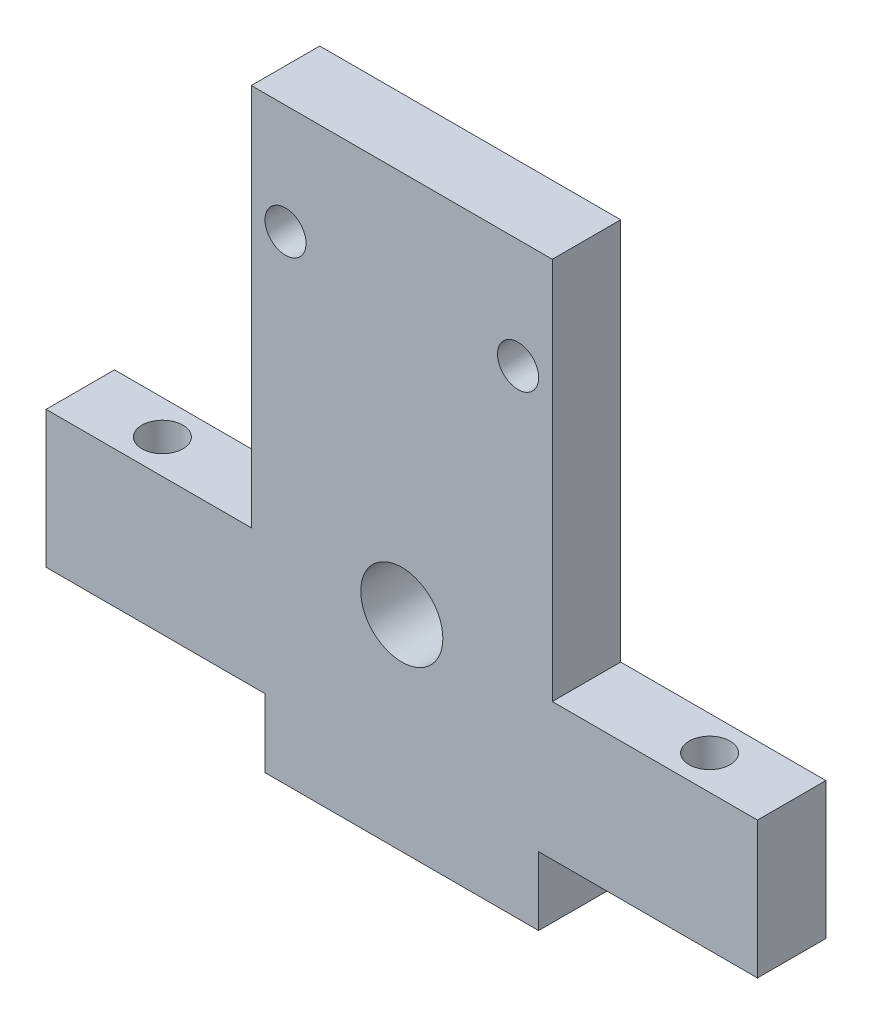
ISO-10303-21;
HEADER;
FILE_DESCRIPTION(('STEP AP214'),'2;1');
FILE_NAME('part.step','',(''),(''),'','','');
FILE_SCHEMA(('AUTOMOTIVE_DESIGN { 1 0 10303 214 1 1 1 1 }'));
ENDSEC;
DATA;
#1=APPLICATION_CONTEXT('core data for automotive mechanical design processes');
#2=APPLICATION_PROTOCOL_DEFINITION('international standard','automotive_design',2000,#1);
#3=PRODUCT_CONTEXT('',#1,'mechanical');
#4=PRODUCT('Part','Part','',(#3));
#5=PRODUCT_RELATED_PRODUCT_CATEGORY('part','',(#4));
#6=PRODUCT_DEFINITION_FORMATION('','',#4);
#7=PRODUCT_DEFINITION_CONTEXT('part definition',#1,'design');
#8=PRODUCT_DEFINITION('design','',#6,#7);
#9=PRODUCT_DEFINITION_SHAPE('','',#8);
#10=(LENGTH_UNIT() NAMED_UNIT(*) SI_UNIT(.MILLI.,.METRE.));
#11=(NAMED_UNIT(*) PLANE_ANGLE_UNIT() SI_UNIT($,.RADIAN.));
#12=(NAMED_UNIT(*) SI_UNIT($,.STERADIAN.) SOLID_ANGLE_UNIT());
#13=UNCERTAINTY_MEASURE_WITH_UNIT(LENGTH_MEASURE(1.E-05),#10,'distance_accuracy_value','');
#14=(GEOMETRIC_REPRESENTATION_CONTEXT(3) GLOBAL_UNCERTAINTY_ASSIGNED_CONTEXT((#13)) GLOBAL_UNIT_ASSIGNED_CONTEXT((#10,
#11,#12)) REPRESENTATION_CONTEXT('',''));
#15=CARTESIAN_POINT('',(0.,0.,0.));
#16=DIRECTION('',(0.,0.,1.));
#17=DIRECTION('',(1.,0.,0.));
#18=AXIS2_PLACEMENT_3D('',#15,#16,#17);
#19=CARTESIAN_POINT('',(0.,0.,5.));
#20=DIRECTION('',(0.,0.,-1.));
#21=DIRECTION('',(-1.,0.,0.));
#22=AXIS2_PLACEMENT_3D('',#19,#20,#21);
#23=PLANE('',#22);
#24=DIRECTION('',(1.,0.,0.));
#25=VECTOR('',#24,1.);
#26=CARTESIAN_POINT('',(11.0839139856643,-16.1701510753259,5.));
#27=LINE('',#26,#25);
#28=CARTESIAN_POINT('',(11.0839139856643,-16.1701510753259,5.));
#29=VERTEX_POINT('',#28);
#30=CARTESIAN_POINT('',(27.0839139856643,-16.1701510753259,5.));
#31=VERTEX_POINT('',#30);
#32=EDGE_CURVE('E179',#29,#31,#27,.T.);
#33=ORIENTED_EDGE('',*,*,#32,.T.);
#34=DIRECTION('',(0.,1.,0.));
#35=VECTOR('',#34,1.);
#36=CARTESIAN_POINT('',(27.0839139856643,-6.17015107532594,5.));
#37=LINE('',#36,#35);
#38=CARTESIAN_POINT('',(27.0839139856643,-6.17015107532594,5.));
#39=VERTEX_POINT('',#38);
#40=EDGE_CURVE('E107',#31,#39,#37,.T.);
#41=ORIENTED_EDGE('',*,*,#40,.T.);
#42=DIRECTION('',(-1.,0.,0.));
#43=VECTOR('',#42,1.);
#44=CARTESIAN_POINT('',(12.0839139856643,-6.17015107532594,5.));
#45=LINE('',#44,#43);
#46=CARTESIAN_POINT('',(12.0839139856643,-6.17015107532594,5.));
#47=VERTEX_POINT('',#46);
#48=EDGE_CURVE('E206',#39,#47,#45,.T.);
#49=ORIENTED_EDGE('',*,*,#48,.T.);
#50=DIRECTION('',(0.,1.,0.));
#51=VECTOR('',#50,1.);
#52=CARTESIAN_POINT('',(12.0839139856643,-6.17015107532594,5.));
#53=LINE('',#52,#51);
#54=CARTESIAN_POINT('',(12.0839139856642,21.8298489246741,5.));
#55=VERTEX_POINT('',#54);
#56=EDGE_CURVE('E225',#47,#55,#53,.T.);
#57=ORIENTED_EDGE('',*,*,#56,.T.);
#58=DIRECTION('',(-1.,0.,0.));
#59=VECTOR('',#58,1.);
#60=CARTESIAN_POINT('',(-9.91608601433575,21.8298489246741,5.));
#61=LINE('',#60,#59);
#62=CARTESIAN_POINT('',(-9.91608601433575,21.8298489246741,5.));
#63=VERTEX_POINT('',#62);
#64=EDGE_CURVE('E222',#55,#63,#61,.T.);
#65=ORIENTED_EDGE('',*,*,#64,.T.);
#66=DIRECTION('',(0.,-1.,0.));
#67=VECTOR('',#66,1.);
#68=CARTESIAN_POINT('',(-9.91608601433574,-6.17015107532594,5.));
#69=LINE('',#68,#67);
#70=CARTESIAN_POINT('',(-9.91608601433574,-6.17015107532594,5.));
#71=VERTEX_POINT('',#70);
#72=EDGE_CURVE('E224',#63,#71,#69,.T.);
#73=ORIENTED_EDGE('',*,*,#72,.T.);
#74=DIRECTION('',(-1.,0.,0.));
#75=VECTOR('',#74,1.);
#76=CARTESIAN_POINT('',(-9.91608601433574,-6.17015107532594,5.));
#77=LINE('',#76,#75);
#78=CARTESIAN_POINT('',(-24.9160860143357,-6.17015107532594,5.));
#79=VERTEX_POINT('',#78);
#80=EDGE_CURVE('E227',#71,#79,#77,.T.);
#81=ORIENTED_EDGE('',*,*,#80,.T.);
#82=DIRECTION('',(0.,-1.,0.));
#83=VECTOR('',#82,1.);
#84=CARTESIAN_POINT('',(-24.9160860143357,-6.17015107532594,5.));
#85=LINE('',#84,#83);
#86=CARTESIAN_POINT('',(-24.9160860143357,-16.1701510753259,5.));
#87=VERTEX_POINT('',#86);
#88=EDGE_CURVE('E233',#79,#87,#85,.T.);
#89=ORIENTED_EDGE('',*,*,#88,.T.);
#90=DIRECTION('',(1.,0.,0.));
#91=VECTOR('',#90,1.);
#92=CARTESIAN_POINT('',(-24.9160860143357,-16.1701510753259,5.));
#93=LINE('',#92,#91);
#94=CARTESIAN_POINT('',(-8.91608601433574,-16.1701510753259,5.));
#95=VERTEX_POINT('',#94);
#96=EDGE_CURVE('E138',#87,#95,#93,.T.);
#97=ORIENTED_EDGE('',*,*,#96,.T.);
#98=DIRECTION('',(0.,-1.,0.));
#99=VECTOR('',#98,1.);
#100=CARTESIAN_POINT('',(-8.91608601433574,-16.1701510753259,5.));
#101=LINE('',#100,#99);
#102=CARTESIAN_POINT('',(-8.91608601433574,-21.1701510753259,5.));
#103=VERTEX_POINT('',#102);
#104=EDGE_CURVE('E132',#95,#103,#101,.T.);
#105=ORIENTED_EDGE('',*,*,#104,.T.);
#106=DIRECTION('',(1.,0.,0.));
#107=VECTOR('',#106,1.);
#108=CARTESIAN_POINT('',(-8.91608601433574,-21.1701510753259,5.));
#109=LINE('',#108,#107);
#110=CARTESIAN_POINT('',(11.0839139856643,-21.1701510753259,5.));
#111=VERTEX_POINT('',#110);
#112=EDGE_CURVE('E136',#103,#111,#109,.T.);
#113=ORIENTED_EDGE('',*,*,#112,.T.);
#114=DIRECTION('',(0.,1.,0.));
#115=VECTOR('',#114,1.);
#116=CARTESIAN_POINT('',(11.0839139856643,-21.1701510753259,5.));
#117=LINE('',#116,#115);
#118=EDGE_CURVE('E52',#111,#29,#117,.T.);
#119=ORIENTED_EDGE('',*,*,#118,.T.);
#120=EDGE_LOOP('',(#33,#41,#49,#57,#65,#73,#81,#89,#97,#105,#113,#119));
#121=FACE_BOUND('',#120,.T.);
#122=CARTESIAN_POINT('',(1.08391398566426,-6.17015107532594,5.));
#123=DIRECTION('',(0.,0.,1.));
#124=DIRECTION('',(1.,0.,0.));
#125=AXIS2_PLACEMENT_3D('',#122,#123,#124);
#126=CIRCLE('',#125,3.);
#127=CARTESIAN_POINT('',(4.08391398566426,-6.17015107532594,5.));
#128=VERTEX_POINT('',#127);
#129=EDGE_CURVE('E160',#128,#128,#126,.T.);
#130=ORIENTED_EDGE('',*,*,#129,.F.);
#131=EDGE_LOOP('',(#130));
#132=FACE_BOUND('',#131,.T.);
#133=CARTESIAN_POINT('',(-7.41608601433575,13.8298489246741,5.));
#134=DIRECTION('',(0.,0.,1.));
#135=DIRECTION('',(1.,0.,0.));
#136=AXIS2_PLACEMENT_3D('',#133,#134,#135);
#137=CIRCLE('',#136,1.5);
#138=CARTESIAN_POINT('',(-5.91608601433575,13.8298489246741,5.));
#139=VERTEX_POINT('',#138);
#140=EDGE_CURVE('E307',#139,#139,#137,.T.);
#141=ORIENTED_EDGE('',*,*,#140,.F.);
#142=EDGE_LOOP('',(#141));
#143=FACE_BOUND('',#142,.T.);
#144=CARTESIAN_POINT('',(9.58391398566425,13.8298489246741,5.));
#145=DIRECTION('',(0.,0.,1.));
#146=DIRECTION('',(-1.,0.,0.));
#147=AXIS2_PLACEMENT_3D('',#144,#145,#146);
#148=CIRCLE('',#147,1.5);
#149=CARTESIAN_POINT('',(8.08391398566425,13.8298489246741,5.));
#150=VERTEX_POINT('',#149);
#151=EDGE_CURVE('E301',#150,#150,#148,.T.);
#152=ORIENTED_EDGE('',*,*,#151,.F.);
#153=EDGE_LOOP('',(#152));
#154=FACE_BOUND('',#153,.T.);
#155=ADVANCED_FACE('F35',(#121,#132,#143,#154),#23,.F.);
#156=CARTESIAN_POINT('',(0.,0.,0.));
#157=DIRECTION('',(0.,0.,-1.));
#158=DIRECTION('',(-1.,0.,0.));
#159=AXIS2_PLACEMENT_3D('',#156,#157,#158);
#160=PLANE('',#159);
#161=CARTESIAN_POINT('',(-7.41608601433575,13.8298489246741,0.));
#162=DIRECTION('',(0.,0.,1.));
#163=DIRECTION('',(1.,0.,0.));
#164=AXIS2_PLACEMENT_3D('',#161,#162,#163);
#165=CIRCLE('',#164,1.5);
#166=CARTESIAN_POINT('',(-5.91608601433575,13.8298489246741,0.));
#167=VERTEX_POINT('',#166);
#168=EDGE_CURVE('E304',#167,#167,#165,.T.);
#169=ORIENTED_EDGE('',*,*,#168,.T.);
#170=EDGE_LOOP('',(#169));
#171=FACE_BOUND('',#170,.T.);
#172=DIRECTION('',(1.,0.,0.));
#173=VECTOR('',#172,1.);
#174=CARTESIAN_POINT('',(11.0839139856643,-16.1701510753259,0.));
#175=LINE('',#174,#173);
#176=CARTESIAN_POINT('',(11.0839139856643,-16.1701510753259,0.));
#177=VERTEX_POINT('',#176);
#178=CARTESIAN_POINT('',(27.0839139856643,-16.1701510753259,0.));
#179=VERTEX_POINT('',#178);
#180=EDGE_CURVE('E156',#177,#179,#175,.T.);
#181=ORIENTED_EDGE('',*,*,#180,.F.);
#182=DIRECTION('',(0.,1.,0.));
#183=VECTOR('',#182,1.);
#184=CARTESIAN_POINT('',(11.0839139856643,-21.1701510753259,0.));
#185=LINE('',#184,#183);
#186=CARTESIAN_POINT('',(11.0839139856643,-21.1701510753259,0.));
#187=VERTEX_POINT('',#186);
#188=EDGE_CURVE('E99',#187,#177,#185,.T.);
#189=ORIENTED_EDGE('',*,*,#188,.F.);
#190=DIRECTION('',(1.,0.,0.));
#191=VECTOR('',#190,1.);
#192=CARTESIAN_POINT('',(-8.91608601433574,-21.1701510753259,0.));
#193=LINE('',#192,#191);
#194=CARTESIAN_POINT('',(-8.91608601433574,-21.1701510753259,0.));
#195=VERTEX_POINT('',#194);
#196=EDGE_CURVE('E93',#195,#187,#193,.T.);
#197=ORIENTED_EDGE('',*,*,#196,.F.);
#198=DIRECTION('',(0.,-1.,0.));
#199=VECTOR('',#198,1.);
#200=CARTESIAN_POINT('',(-8.91608601433574,-16.1701510753259,0.));
#201=LINE('',#200,#199);
#202=CARTESIAN_POINT('',(-8.91608601433574,-16.1701510753259,0.));
#203=VERTEX_POINT('',#202);
#204=EDGE_CURVE('E146',#203,#195,#201,.T.);
#205=ORIENTED_EDGE('',*,*,#204,.F.);
#206=DIRECTION('',(1.,0.,0.));
#207=VECTOR('',#206,1.);
#208=CARTESIAN_POINT('',(-24.9160860143357,-16.1701510753259,0.));
#209=LINE('',#208,#207);
#210=CARTESIAN_POINT('',(-24.9160860143357,-16.1701510753259,0.));
#211=VERTEX_POINT('',#210);
#212=EDGE_CURVE('E174',#211,#203,#209,.T.);
#213=ORIENTED_EDGE('',*,*,#212,.F.);
#214=DIRECTION('',(0.,-1.,0.));
#215=VECTOR('',#214,1.);
#216=CARTESIAN_POINT('',(-24.9160860143357,-6.17015107532594,0.));
#217=LINE('',#216,#215);
#218=CARTESIAN_POINT('',(-24.9160860143357,-6.17015107532594,0.));
#219=VERTEX_POINT('',#218);
#220=EDGE_CURVE('E172',#219,#211,#217,.T.);
#221=ORIENTED_EDGE('',*,*,#220,.F.);
#222=DIRECTION('',(-1.,0.,0.));
#223=VECTOR('',#222,1.);
#224=CARTESIAN_POINT('',(-9.91608601433574,-6.17015107532594,0.));
#225=LINE('',#224,#223);
#226=CARTESIAN_POINT('',(-9.91608601433574,-6.17015107532594,0.));
#227=VERTEX_POINT('',#226);
#228=EDGE_CURVE('E170',#227,#219,#225,.T.);
#229=ORIENTED_EDGE('',*,*,#228,.F.);
#230=DIRECTION('',(0.,-1.,0.));
#231=VECTOR('',#230,1.);
#232=CARTESIAN_POINT('',(-9.91608601433574,-6.17015107532594,0.));
#233=LINE('',#232,#231);
#234=CARTESIAN_POINT('',(-9.91608601433575,21.8298489246741,0.));
#235=VERTEX_POINT('',#234);
#236=EDGE_CURVE('E168',#235,#227,#233,.T.);
#237=ORIENTED_EDGE('',*,*,#236,.F.);
#238=DIRECTION('',(-1.,0.,0.));
#239=VECTOR('',#238,1.);
#240=CARTESIAN_POINT('',(-9.91608601433575,21.8298489246741,0.));
#241=LINE('',#240,#239);
#242=CARTESIAN_POINT('',(12.0839139856642,21.8298489246741,0.));
#243=VERTEX_POINT('',#242);
#244=EDGE_CURVE('E166',#243,#235,#241,.T.);
#245=ORIENTED_EDGE('',*,*,#244,.F.);
#246=DIRECTION('',(0.,1.,0.));
#247=VECTOR('',#246,1.);
#248=CARTESIAN_POINT('',(12.0839139856643,-6.17015107532594,0.));
#249=LINE('',#248,#247);
#250=CARTESIAN_POINT('',(12.0839139856643,-6.17015107532594,0.));
#251=VERTEX_POINT('',#250);
#252=EDGE_CURVE('E164',#251,#243,#249,.T.);
#253=ORIENTED_EDGE('',*,*,#252,.F.);
#254=DIRECTION('',(-1.,0.,0.));
#255=VECTOR('',#254,1.);
#256=CARTESIAN_POINT('',(12.0839139856643,-6.17015107532594,0.));
#257=LINE('',#256,#255);
#258=CARTESIAN_POINT('',(27.0839139856643,-6.17015107532594,0.));
#259=VERTEX_POINT('',#258);
#260=EDGE_CURVE('E162',#259,#251,#257,.T.);
#261=ORIENTED_EDGE('',*,*,#260,.F.);
#262=DIRECTION('',(0.,1.,0.));
#263=VECTOR('',#262,1.);
#264=CARTESIAN_POINT('',(27.0839139856643,-6.17015107532594,0.));
#265=LINE('',#264,#263);
#266=EDGE_CURVE('E159',#179,#259,#265,.T.);
#267=ORIENTED_EDGE('',*,*,#266,.F.);
#268=EDGE_LOOP('',(#181,#189,#197,#205,#213,#221,#229,#237,#245,#253,#261,#267));
#269=FACE_BOUND('',#268,.T.);
#270=CARTESIAN_POINT('',(1.08391398566426,-6.17015107532594,0.));
#271=DIRECTION('',(0.,0.,1.));
#272=DIRECTION('',(1.,0.,0.));
#273=AXIS2_PLACEMENT_3D('',#270,#271,#272);
#274=CIRCLE('',#273,3.);
#275=CARTESIAN_POINT('',(4.08391398566426,-6.17015107532594,0.));
#276=VERTEX_POINT('',#275);
#277=EDGE_CURVE('E310',#276,#276,#274,.T.);
#278=ORIENTED_EDGE('',*,*,#277,.T.);
#279=EDGE_LOOP('',(#278));
#280=FACE_BOUND('',#279,.T.);
#281=CARTESIAN_POINT('',(9.58391398566425,13.8298489246741,0.));
#282=DIRECTION('',(0.,0.,1.));
#283=DIRECTION('',(-1.,0.,0.));
#284=AXIS2_PLACEMENT_3D('',#281,#282,#283);
#285=CIRCLE('',#284,1.5);
#286=CARTESIAN_POINT('',(8.08391398566425,13.8298489246741,0.));
#287=VERTEX_POINT('',#286);
#288=EDGE_CURVE('E298',#287,#287,#285,.T.);
#289=ORIENTED_EDGE('',*,*,#288,.T.);
#290=EDGE_LOOP('',(#289));
#291=FACE_BOUND('',#290,.T.);
#292=ADVANCED_FACE('F210',(#171,#269,#280,#291),#160,.T.);
#293=CARTESIAN_POINT('',(11.0839139856643,-16.1701510753259,5.));
#294=DIRECTION('',(0.,1.,0.));
#295=DIRECTION('',(0.,0.,1.));
#296=AXIS2_PLACEMENT_3D('',#293,#294,#295);
#297=PLANE('',#296);
#298=CARTESIAN_POINT('',(21.0839139856642,-16.1701510753259,2.5));
#299=DIRECTION('',(0.,1.,0.));
#300=DIRECTION('',(1.,0.,0.));
#301=AXIS2_PLACEMENT_3D('',#298,#299,#300);
#302=CIRCLE('',#301,1.49999999999999);
#303=CARTESIAN_POINT('',(22.5839139856642,-16.1701510753259,2.5));
#304=VERTEX_POINT('',#303);
#305=EDGE_CURVE('E286',#304,#304,#302,.T.);
#306=ORIENTED_EDGE('',*,*,#305,.T.);
#307=EDGE_LOOP('',(#306));
#308=FACE_BOUND('',#307,.T.);
#309=ORIENTED_EDGE('',*,*,#180,.T.);
#310=DIRECTION('',(0.,0.,-1.));
#311=VECTOR('',#310,1.);
#312=CARTESIAN_POINT('',(27.0839139856643,-16.1701510753259,5.));
#313=LINE('',#312,#311);
#314=EDGE_CURVE('E11',#31,#179,#313,.T.);
#315=ORIENTED_EDGE('',*,*,#314,.F.);
#316=ORIENTED_EDGE('',*,*,#32,.F.);
#317=DIRECTION('',(0.,0.,-1.));
#318=VECTOR('',#317,1.);
#319=CARTESIAN_POINT('',(11.0839139856643,-16.1701510753259,5.));
#320=LINE('',#319,#318);
#321=EDGE_CURVE('E152',#29,#177,#320,.T.);
#322=ORIENTED_EDGE('',*,*,#321,.T.);
#323=EDGE_LOOP('',(#309,#315,#316,#322));
#324=FACE_BOUND('',#323,.T.);
#325=ADVANCED_FACE('F37',(#308,#324),#297,.F.);
#326=CARTESIAN_POINT('',(27.0839139856643,-6.17015107532594,5.));
#327=DIRECTION('',(-1.,0.,0.));
#328=DIRECTION('',(0.,0.,1.));
#329=AXIS2_PLACEMENT_3D('',#326,#327,#328);
#330=PLANE('',#329);
#331=ORIENTED_EDGE('',*,*,#266,.T.);
#332=DIRECTION('',(0.,0.,-1.));
#333=VECTOR('',#332,1.);
#334=CARTESIAN_POINT('',(27.0839139856643,-6.17015107532594,5.));
#335=LINE('',#334,#333);
#336=EDGE_CURVE('E44',#39,#259,#335,.T.);
#337=ORIENTED_EDGE('',*,*,#336,.F.);
#338=ORIENTED_EDGE('',*,*,#40,.F.);
#339=ORIENTED_EDGE('',*,*,#314,.T.);
#340=EDGE_LOOP('',(#331,#337,#338,#339));
#341=FACE_BOUND('',#340,.T.);
#342=ADVANCED_FACE('F352',(#341),#330,.F.);
#343=CARTESIAN_POINT('',(12.0839139856643,-6.17015107532594,5.));
#344=DIRECTION('',(0.,-1.,0.));
#345=DIRECTION('',(1.,0.,0.));
#346=AXIS2_PLACEMENT_3D('',#343,#344,#345);
#347=PLANE('',#346);
#348=CARTESIAN_POINT('',(21.0839139856642,-6.17015107532594,2.5));
#349=DIRECTION('',(0.,1.,0.));
#350=DIRECTION('',(1.,0.,0.));
#351=AXIS2_PLACEMENT_3D('',#348,#349,#350);
#352=CIRCLE('',#351,1.49999999999999);
#353=CARTESIAN_POINT('',(22.5839139856642,-6.17015107532594,2.5));
#354=VERTEX_POINT('',#353);
#355=EDGE_CURVE('E289',#354,#354,#352,.T.);
#356=ORIENTED_EDGE('',*,*,#355,.F.);
#357=EDGE_LOOP('',(#356));
#358=FACE_BOUND('',#357,.T.);
#359=ORIENTED_EDGE('',*,*,#260,.T.);
#360=DIRECTION('',(0.,0.,-1.));
#361=VECTOR('',#360,1.);
#362=CARTESIAN_POINT('',(12.0839139856643,-6.17015107532594,5.));
#363=LINE('',#362,#361);
#364=EDGE_CURVE('E198',#47,#251,#363,.T.);
#365=ORIENTED_EDGE('',*,*,#364,.F.);
#366=ORIENTED_EDGE('',*,*,#48,.F.);
#367=ORIENTED_EDGE('',*,*,#336,.T.);
#368=EDGE_LOOP('',(#359,#365,#366,#367));
#369=FACE_BOUND('',#368,.T.);
#370=ADVANCED_FACE('F204',(#358,#369),#347,.F.);
#371=CARTESIAN_POINT('',(12.0839139856643,-6.17015107532594,5.));
#372=DIRECTION('',(-1.,0.,0.));
#373=DIRECTION('',(0.,-1.,0.));
#374=AXIS2_PLACEMENT_3D('',#371,#372,#373);
#375=PLANE('',#374);
#376=ORIENTED_EDGE('',*,*,#252,.T.);
#377=DIRECTION('',(0.,0.,-1.));
#378=VECTOR('',#377,1.);
#379=CARTESIAN_POINT('',(12.0839139856642,21.8298489246741,5.));
#380=LINE('',#379,#378);
#381=EDGE_CURVE('E195',#55,#243,#380,.T.);
#382=ORIENTED_EDGE('',*,*,#381,.F.);
#383=ORIENTED_EDGE('',*,*,#56,.F.);
#384=ORIENTED_EDGE('',*,*,#364,.T.);
#385=EDGE_LOOP('',(#376,#382,#383,#384));
#386=FACE_BOUND('',#385,.T.);
#387=ADVANCED_FACE('F216',(#386),#375,.F.);
#388=CARTESIAN_POINT('',(-9.91608601433575,21.8298489246741,5.));
#389=DIRECTION('',(0.,-1.,0.));
#390=DIRECTION('',(1.,0.,0.));
#391=AXIS2_PLACEMENT_3D('',#388,#389,#390);
#392=PLANE('',#391);
#393=ORIENTED_EDGE('',*,*,#244,.T.);
#394=DIRECTION('',(0.,0.,-1.));
#395=VECTOR('',#394,1.);
#396=CARTESIAN_POINT('',(-9.91608601433575,21.8298489246741,5.));
#397=LINE('',#396,#395);
#398=EDGE_CURVE('E192',#63,#235,#397,.T.);
#399=ORIENTED_EDGE('',*,*,#398,.F.);
#400=ORIENTED_EDGE('',*,*,#64,.F.);
#401=ORIENTED_EDGE('',*,*,#381,.T.);
#402=EDGE_LOOP('',(#393,#399,#400,#401));
#403=FACE_BOUND('',#402,.T.);
#404=ADVANCED_FACE('F220',(#403),#392,.F.);
#405=CARTESIAN_POINT('',(-9.91608601433574,-6.17015107532594,5.));
#406=DIRECTION('',(1.,0.,0.));
#407=DIRECTION('',(0.,1.,0.));
#408=AXIS2_PLACEMENT_3D('',#405,#406,#407);
#409=PLANE('',#408);
#410=ORIENTED_EDGE('',*,*,#236,.T.);
#411=DIRECTION('',(0.,0.,-1.));
#412=VECTOR('',#411,1.);
#413=CARTESIAN_POINT('',(-9.91608601433574,-6.17015107532594,5.));
#414=LINE('',#413,#412);
#415=EDGE_CURVE('E189',#71,#227,#414,.T.);
#416=ORIENTED_EDGE('',*,*,#415,.F.);
#417=ORIENTED_EDGE('',*,*,#72,.F.);
#418=ORIENTED_EDGE('',*,*,#398,.T.);
#419=EDGE_LOOP('',(#410,#416,#417,#418));
#420=FACE_BOUND('',#419,.T.);
#421=ADVANCED_FACE('F336',(#420),#409,.F.);
#422=CARTESIAN_POINT('',(-9.91608601433574,-6.17015107532594,5.));
#423=DIRECTION('',(0.,-1.,0.));
#424=DIRECTION('',(1.,0.,0.));
#425=AXIS2_PLACEMENT_3D('',#422,#423,#424);
#426=PLANE('',#425);
#427=CARTESIAN_POINT('',(-18.9160860143357,-6.17015107532594,2.5));
#428=DIRECTION('',(0.,1.,0.));
#429=DIRECTION('',(-1.,0.,0.));
#430=AXIS2_PLACEMENT_3D('',#427,#428,#429);
#431=CIRCLE('',#430,1.5);
#432=CARTESIAN_POINT('',(-20.4160860143357,-6.17015107532594,2.5));
#433=VERTEX_POINT('',#432);
#434=EDGE_CURVE('E292',#433,#433,#431,.T.);
#435=ORIENTED_EDGE('',*,*,#434,.F.);
#436=EDGE_LOOP('',(#435));
#437=FACE_BOUND('',#436,.T.);
#438=ORIENTED_EDGE('',*,*,#228,.T.);
#439=DIRECTION('',(0.,0.,-1.));
#440=VECTOR('',#439,1.);
#441=CARTESIAN_POINT('',(-24.9160860143357,-6.17015107532594,5.));
#442=LINE('',#441,#440);
#443=EDGE_CURVE('E186',#79,#219,#442,.T.);
#444=ORIENTED_EDGE('',*,*,#443,.F.);
#445=ORIENTED_EDGE('',*,*,#80,.F.);
#446=ORIENTED_EDGE('',*,*,#415,.T.);
#447=EDGE_LOOP('',(#438,#444,#445,#446));
#448=FACE_BOUND('',#447,.T.);
#449=ADVANCED_FACE('F333',(#437,#448),#426,.F.);
#450=CARTESIAN_POINT('',(-24.9160860143357,-6.17015107532594,5.));
#451=DIRECTION('',(1.,0.,0.));
#452=DIRECTION('',(0.,0.,-1.));
#453=AXIS2_PLACEMENT_3D('',#450,#451,#452);
#454=PLANE('',#453);
#455=ORIENTED_EDGE('',*,*,#220,.T.);
#456=DIRECTION('',(0.,0.,-1.));
#457=VECTOR('',#456,1.);
#458=CARTESIAN_POINT('',(-24.9160860143357,-16.1701510753259,5.));
#459=LINE('',#458,#457);
#460=EDGE_CURVE('E183',#87,#211,#459,.T.);
#461=ORIENTED_EDGE('',*,*,#460,.F.);
#462=ORIENTED_EDGE('',*,*,#88,.F.);
#463=ORIENTED_EDGE('',*,*,#443,.T.);
#464=EDGE_LOOP('',(#455,#461,#462,#463));
#465=FACE_BOUND('',#464,.T.);
#466=ADVANCED_FACE('F239',(#465),#454,.F.);
#467=CARTESIAN_POINT('',(-24.9160860143357,-16.1701510753259,5.));
#468=DIRECTION('',(0.,1.,0.));
#469=DIRECTION('',(0.,0.,1.));
#470=AXIS2_PLACEMENT_3D('',#467,#468,#469);
#471=PLANE('',#470);
#472=CARTESIAN_POINT('',(-18.9160860143357,-16.1701510753259,2.5));
#473=DIRECTION('',(0.,1.,0.));
#474=DIRECTION('',(-1.,0.,0.));
#475=AXIS2_PLACEMENT_3D('',#472,#473,#474);
#476=CIRCLE('',#475,1.5);
#477=CARTESIAN_POINT('',(-20.4160860143357,-16.1701510753259,2.5));
#478=VERTEX_POINT('',#477);
#479=EDGE_CURVE('E295',#478,#478,#476,.T.);
#480=ORIENTED_EDGE('',*,*,#479,.T.);
#481=EDGE_LOOP('',(#480));
#482=FACE_BOUND('',#481,.T.);
#483=ORIENTED_EDGE('',*,*,#212,.T.);
#484=DIRECTION('',(0.,0.,-1.));
#485=VECTOR('',#484,1.);
#486=CARTESIAN_POINT('',(-8.91608601433574,-16.1701510753259,5.));
#487=LINE('',#486,#485);
#488=EDGE_CURVE('E147',#95,#203,#487,.T.);
#489=ORIENTED_EDGE('',*,*,#488,.F.);
#490=ORIENTED_EDGE('',*,*,#96,.F.);
#491=ORIENTED_EDGE('',*,*,#460,.T.);
#492=EDGE_LOOP('',(#483,#489,#490,#491));
#493=FACE_BOUND('',#492,.T.);
#494=ADVANCED_FACE('F243',(#482,#493),#471,.F.);
#495=CARTESIAN_POINT('',(-8.91608601433574,-16.1701510753259,5.));
#496=DIRECTION('',(1.,0.,0.));
#497=DIRECTION('',(0.,0.,-1.));
#498=AXIS2_PLACEMENT_3D('',#495,#496,#497);
#499=PLANE('',#498);
#500=ORIENTED_EDGE('',*,*,#204,.T.);
#501=DIRECTION('',(0.,0.,-1.));
#502=VECTOR('',#501,1.);
#503=CARTESIAN_POINT('',(-8.91608601433574,-21.1701510753259,5.));
#504=LINE('',#503,#502);
#505=EDGE_CURVE('E143',#103,#195,#504,.T.);
#506=ORIENTED_EDGE('',*,*,#505,.F.);
#507=ORIENTED_EDGE('',*,*,#104,.F.);
#508=ORIENTED_EDGE('',*,*,#488,.T.);
#509=EDGE_LOOP('',(#500,#506,#507,#508));
#510=FACE_BOUND('',#509,.T.);
#511=ADVANCED_FACE('F144',(#510),#499,.F.);
#512=CARTESIAN_POINT('',(-8.91608601433574,-21.1701510753259,5.));
#513=DIRECTION('',(0.,1.,0.));
#514=DIRECTION('',(0.,0.,1.));
#515=AXIS2_PLACEMENT_3D('',#512,#513,#514);
#516=PLANE('',#515);
#517=ORIENTED_EDGE('',*,*,#196,.T.);
#518=DIRECTION('',(0.,0.,-1.));
#519=VECTOR('',#518,1.);
#520=CARTESIAN_POINT('',(11.0839139856643,-21.1701510753259,5.));
#521=LINE('',#520,#519);
#522=EDGE_CURVE('E148',#111,#187,#521,.T.);
#523=ORIENTED_EDGE('',*,*,#522,.F.);
#524=ORIENTED_EDGE('',*,*,#112,.F.);
#525=ORIENTED_EDGE('',*,*,#505,.T.);
#526=EDGE_LOOP('',(#517,#523,#524,#525));
#527=FACE_BOUND('',#526,.T.);
#528=ADVANCED_FACE('F150',(#527),#516,.F.);
#529=CARTESIAN_POINT('',(11.0839139856643,-21.1701510753259,5.));
#530=DIRECTION('',(-1.,0.,0.));
#531=DIRECTION('',(0.,0.,1.));
#532=AXIS2_PLACEMENT_3D('',#529,#530,#531);
#533=PLANE('',#532);
#534=ORIENTED_EDGE('',*,*,#188,.T.);
#535=ORIENTED_EDGE('',*,*,#321,.F.);
#536=ORIENTED_EDGE('',*,*,#118,.F.);
#537=ORIENTED_EDGE('',*,*,#522,.T.);
#538=EDGE_LOOP('',(#534,#535,#536,#537));
#539=FACE_BOUND('',#538,.T.);
#540=ADVANCED_FACE('F247',(#539),#533,.F.);
#541=CARTESIAN_POINT('',(1.08391398566426,-6.17015107532594,5.));
#542=DIRECTION('',(0.,0.,-1.));
#543=DIRECTION('',(-1.,0.,0.));
#544=AXIS2_PLACEMENT_3D('',#541,#542,#543);
#545=CYLINDRICAL_SURFACE('',#544,3.);
#546=ORIENTED_EDGE('',*,*,#129,.T.);
#547=EDGE_LOOP('',(#546));
#548=FACE_BOUND('',#547,.T.);
#549=ORIENTED_EDGE('',*,*,#277,.F.);
#550=EDGE_LOOP('',(#549));
#551=FACE_BOUND('',#550,.T.);
#552=ADVANCED_FACE('F249',(#548,#551),#545,.F.);
#553=CARTESIAN_POINT('',(-7.41608601433575,13.8298489246741,5.));
#554=DIRECTION('',(0.,0.,-1.));
#555=DIRECTION('',(-1.,0.,0.));
#556=AXIS2_PLACEMENT_3D('',#553,#554,#555);
#557=CYLINDRICAL_SURFACE('',#556,1.5);
#558=ORIENTED_EDGE('',*,*,#140,.T.);
#559=EDGE_LOOP('',(#558));
#560=FACE_BOUND('',#559,.T.);
#561=ORIENTED_EDGE('',*,*,#168,.F.);
#562=EDGE_LOOP('',(#561));
#563=FACE_BOUND('',#562,.T.);
#564=ADVANCED_FACE('F255',(#560,#563),#557,.F.);
#565=CARTESIAN_POINT('',(9.58391398566425,13.8298489246741,5.));
#566=DIRECTION('',(0.,0.,-1.));
#567=DIRECTION('',(-1.,0.,0.));
#568=AXIS2_PLACEMENT_3D('',#565,#566,#567);
#569=CYLINDRICAL_SURFACE('',#568,1.5);
#570=ORIENTED_EDGE('',*,*,#151,.T.);
#571=EDGE_LOOP('',(#570));
#572=FACE_BOUND('',#571,.T.);
#573=ORIENTED_EDGE('',*,*,#288,.F.);
#574=EDGE_LOOP('',(#573));
#575=FACE_BOUND('',#574,.T.);
#576=ADVANCED_FACE('F269',(#572,#575),#569,.F.);
#577=CARTESIAN_POINT('',(-18.9160860143357,-16.1701510753259,2.5));
#578=DIRECTION('',(0.,1.,0.));
#579=DIRECTION('',(-1.,0.,0.));
#580=AXIS2_PLACEMENT_3D('',#577,#578,#579);
#581=CYLINDRICAL_SURFACE('',#580,1.5);
#582=ORIENTED_EDGE('',*,*,#479,.F.);
#583=EDGE_LOOP('',(#582));
#584=FACE_BOUND('',#583,.T.);
#585=ORIENTED_EDGE('',*,*,#434,.T.);
#586=EDGE_LOOP('',(#585));
#587=FACE_BOUND('',#586,.T.);
#588=ADVANCED_FACE('F273',(#584,#587),#581,.F.);
#589=CARTESIAN_POINT('',(21.0839139856642,-16.1701510753259,2.5));
#590=DIRECTION('',(0.,1.,0.));
#591=DIRECTION('',(-1.,0.,0.));
#592=AXIS2_PLACEMENT_3D('',#589,#590,#591);
#593=CYLINDRICAL_SURFACE('',#592,1.49999999999999);
#594=ORIENTED_EDGE('',*,*,#305,.F.);
#595=EDGE_LOOP('',(#594));
#596=FACE_BOUND('',#595,.T.);
#597=ORIENTED_EDGE('',*,*,#355,.T.);
#598=EDGE_LOOP('',(#597));
#599=FACE_BOUND('',#598,.T.);
#600=ADVANCED_FACE('F277',(#596,#599),#593,.F.);
#601=CLOSED_SHELL('',(#155,#292,#325,#342,#370,#387,#404,#421,#449,#466,#494,#511,#528,#540,
#552,#564,#576,#588,#600));
#602=MANIFOLD_SOLID_BREP('B2',#601);
#603=ADVANCED_BREP_SHAPE_REPRESENTATION('',(#18,#602),#14);
#604=SHAPE_DEFINITION_REPRESENTATION(#9,#603);
ENDSEC;
END-ISO-10303-21;
